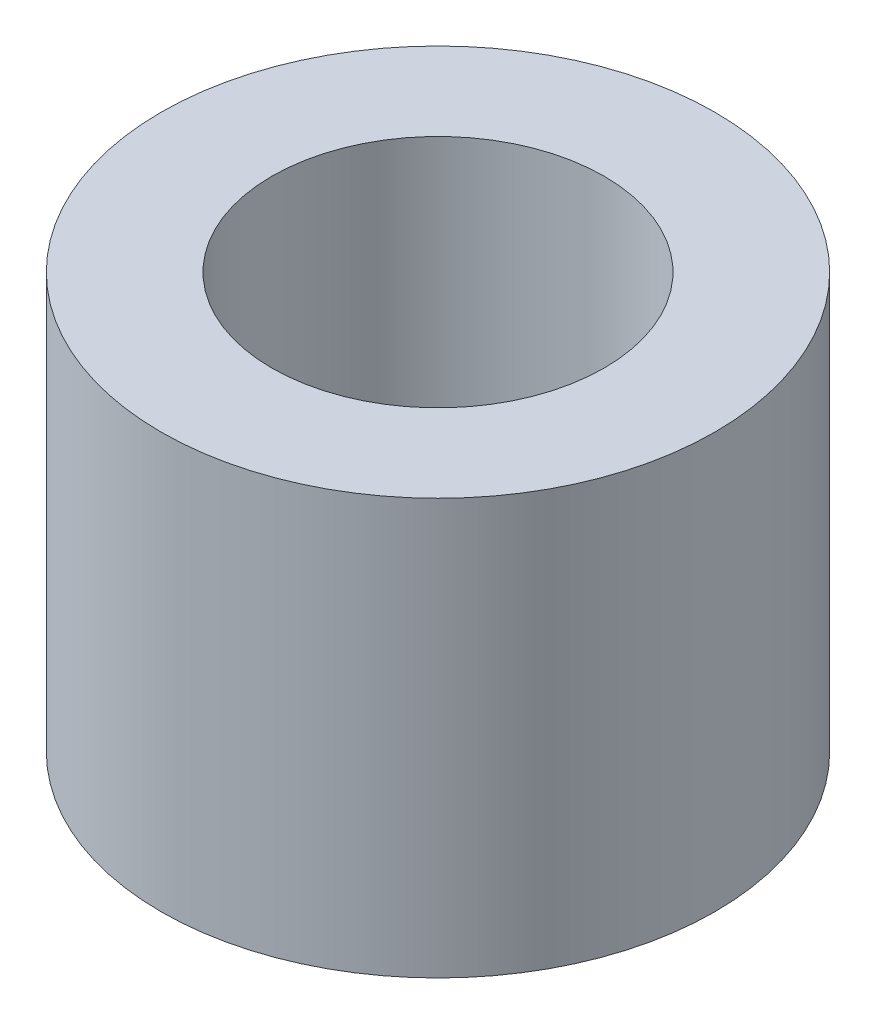
ISO-10303-21;
HEADER;
FILE_DESCRIPTION(('STEP AP214'),'2;1');
FILE_NAME('part.step','',(''),(''),'','','');
FILE_SCHEMA(('AUTOMOTIVE_DESIGN { 1 0 10303 214 1 1 1 1 }'));
ENDSEC;
DATA;
#1=APPLICATION_CONTEXT('core data for automotive mechanical design processes');
#2=APPLICATION_PROTOCOL_DEFINITION('international standard','automotive_design',2000,#1);
#3=PRODUCT_CONTEXT('',#1,'mechanical');
#4=PRODUCT('Part','Part','',(#3));
#5=PRODUCT_RELATED_PRODUCT_CATEGORY('part','',(#4));
#6=PRODUCT_DEFINITION_FORMATION('','',#4);
#7=PRODUCT_DEFINITION_CONTEXT('part definition',#1,'design');
#8=PRODUCT_DEFINITION('design','',#6,#7);
#9=PRODUCT_DEFINITION_SHAPE('','',#8);
#10=(LENGTH_UNIT() NAMED_UNIT(*) SI_UNIT(.MILLI.,.METRE.));
#11=(NAMED_UNIT(*) PLANE_ANGLE_UNIT() SI_UNIT($,.RADIAN.));
#12=(NAMED_UNIT(*) SI_UNIT($,.STERADIAN.) SOLID_ANGLE_UNIT());
#13=UNCERTAINTY_MEASURE_WITH_UNIT(LENGTH_MEASURE(1.E-05),#10,'distance_accuracy_value','');
#14=(GEOMETRIC_REPRESENTATION_CONTEXT(3) GLOBAL_UNCERTAINTY_ASSIGNED_CONTEXT((#13)) GLOBAL_UNIT_ASSIGNED_CONTEXT((#10,
#11,#12)) REPRESENTATION_CONTEXT('',''));
#15=CARTESIAN_POINT('',(0.,0.,0.));
#16=DIRECTION('',(0.,0.,1.));
#17=DIRECTION('',(1.,0.,0.));
#18=AXIS2_PLACEMENT_3D('',#15,#16,#17);
#19=CARTESIAN_POINT('',(0.,3.,0.));
#20=DIRECTION('',(0.,1.,0.));
#21=DIRECTION('',(0.,0.,1.));
#22=AXIS2_PLACEMENT_3D('',#19,#20,#21);
#23=PLANE('',#22);
#24=CARTESIAN_POINT('',(0.,3.,0.));
#25=DIRECTION('',(0.,1.,0.));
#26=DIRECTION('',(0.,0.,1.));
#27=AXIS2_PLACEMENT_3D('',#24,#25,#26);
#28=CIRCLE('',#27,2.);
#29=CARTESIAN_POINT('',(0.,3.,2.));
#30=VERTEX_POINT('',#29);
#31=EDGE_CURVE('E10',#30,#30,#28,.T.);
#32=ORIENTED_EDGE('',*,*,#31,.T.);
#33=EDGE_LOOP('',(#32));
#34=FACE_BOUND('',#33,.T.);
#35=CARTESIAN_POINT('',(0.,3.,0.));
#36=DIRECTION('',(0.,1.,0.));
#37=DIRECTION('',(0.,0.,1.));
#38=AXIS2_PLACEMENT_3D('',#35,#36,#37);
#39=CIRCLE('',#38,1.2);
#40=CARTESIAN_POINT('',(0.,3.,1.2));
#41=VERTEX_POINT('',#40);
#42=EDGE_CURVE('E42',#41,#41,#39,.T.);
#43=ORIENTED_EDGE('',*,*,#42,.F.);
#44=EDGE_LOOP('',(#43));
#45=FACE_BOUND('',#44,.T.);
#46=ADVANCED_FACE('F31',(#34,#45),#23,.T.);
#47=CARTESIAN_POINT('',(0.,0.,0.));
#48=DIRECTION('',(0.,1.,0.));
#49=DIRECTION('',(0.,0.,1.));
#50=AXIS2_PLACEMENT_3D('',#47,#48,#49);
#51=PLANE('',#50);
#52=CARTESIAN_POINT('',(0.,0.,0.));
#53=DIRECTION('',(0.,1.,0.));
#54=DIRECTION('',(0.,0.,1.));
#55=AXIS2_PLACEMENT_3D('',#52,#53,#54);
#56=CIRCLE('',#55,2.);
#57=CARTESIAN_POINT('',(0.,0.,2.));
#58=VERTEX_POINT('',#57);
#59=EDGE_CURVE('E35',#58,#58,#56,.T.);
#60=ORIENTED_EDGE('',*,*,#59,.F.);
#61=EDGE_LOOP('',(#60));
#62=FACE_BOUND('',#61,.T.);
#63=CARTESIAN_POINT('',(0.,0.,0.));
#64=DIRECTION('',(0.,1.,0.));
#65=DIRECTION('',(0.,0.,1.));
#66=AXIS2_PLACEMENT_3D('',#63,#64,#65);
#67=CIRCLE('',#66,1.2);
#68=CARTESIAN_POINT('',(0.,0.,1.2));
#69=VERTEX_POINT('',#68);
#70=EDGE_CURVE('E44',#69,#69,#67,.T.);
#71=ORIENTED_EDGE('',*,*,#70,.T.);
#72=EDGE_LOOP('',(#71));
#73=FACE_BOUND('',#72,.T.);
#74=ADVANCED_FACE('F54',(#62,#73),#51,.F.);
#75=CARTESIAN_POINT('',(0.,3.,0.));
#76=DIRECTION('',(0.,-1.,0.));
#77=DIRECTION('',(0.,0.,-1.));
#78=AXIS2_PLACEMENT_3D('',#75,#76,#77);
#79=CYLINDRICAL_SURFACE('',#78,2.);
#80=ORIENTED_EDGE('',*,*,#31,.F.);
#81=EDGE_LOOP('',(#80));
#82=FACE_BOUND('',#81,.T.);
#83=ORIENTED_EDGE('',*,*,#59,.T.);
#84=EDGE_LOOP('',(#83));
#85=FACE_BOUND('',#84,.T.);
#86=ADVANCED_FACE('F33',(#82,#85),#79,.T.);
#87=CARTESIAN_POINT('',(0.,3.,0.));
#88=DIRECTION('',(0.,-1.,0.));
#89=DIRECTION('',(0.,0.,-1.));
#90=AXIS2_PLACEMENT_3D('',#87,#88,#89);
#91=CYLINDRICAL_SURFACE('',#90,1.2);
#92=ORIENTED_EDGE('',*,*,#42,.T.);
#93=EDGE_LOOP('',(#92));
#94=FACE_BOUND('',#93,.T.);
#95=ORIENTED_EDGE('',*,*,#70,.F.);
#96=EDGE_LOOP('',(#95));
#97=FACE_BOUND('',#96,.T.);
#98=ADVANCED_FACE('F50',(#94,#97),#91,.F.);
#99=CLOSED_SHELL('',(#46,#74,#86,#98));
#100=MANIFOLD_SOLID_BREP('B2',#99);
#101=ADVANCED_BREP_SHAPE_REPRESENTATION('',(#18,#100),#14);
#102=SHAPE_DEFINITION_REPRESENTATION(#9,#101);
ENDSEC;
END-ISO-10303-21;
